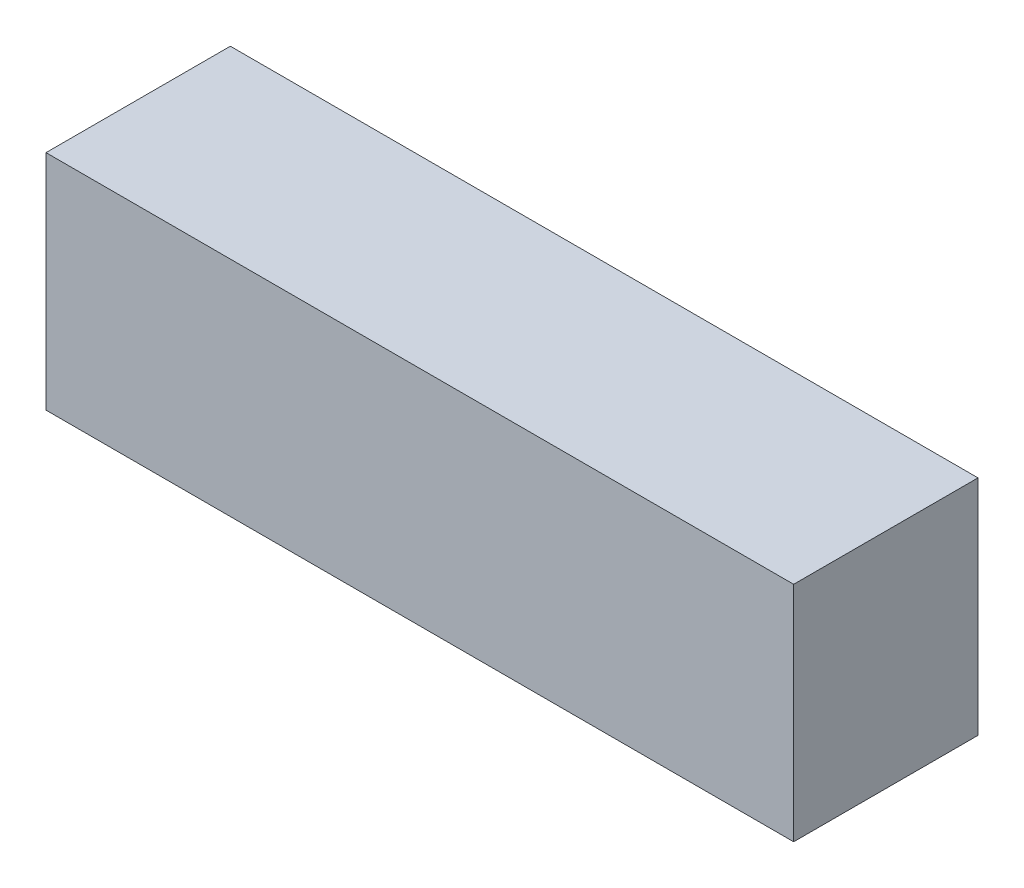
ISO-10303-21;
HEADER;
FILE_DESCRIPTION(('STEP AP214'),'2;1');
FILE_NAME('part.step','',(''),(''),'','','');
FILE_SCHEMA(('AUTOMOTIVE_DESIGN { 1 0 10303 214 1 1 1 1 }'));
ENDSEC;
DATA;
#1=APPLICATION_CONTEXT('core data for automotive mechanical design processes');
#2=APPLICATION_PROTOCOL_DEFINITION('international standard','automotive_design',2000,#1);
#3=PRODUCT_CONTEXT('',#1,'mechanical');
#4=PRODUCT('Part','Part','',(#3));
#5=PRODUCT_RELATED_PRODUCT_CATEGORY('part','',(#4));
#6=PRODUCT_DEFINITION_FORMATION('','',#4);
#7=PRODUCT_DEFINITION_CONTEXT('part definition',#1,'design');
#8=PRODUCT_DEFINITION('design','',#6,#7);
#9=PRODUCT_DEFINITION_SHAPE('','',#8);
#10=(LENGTH_UNIT() NAMED_UNIT(*) SI_UNIT(.MILLI.,.METRE.));
#11=(NAMED_UNIT(*) PLANE_ANGLE_UNIT() SI_UNIT($,.RADIAN.));
#12=(NAMED_UNIT(*) SI_UNIT($,.STERADIAN.) SOLID_ANGLE_UNIT());
#13=UNCERTAINTY_MEASURE_WITH_UNIT(LENGTH_MEASURE(1.E-05),#10,'distance_accuracy_value','');
#14=(GEOMETRIC_REPRESENTATION_CONTEXT(3) GLOBAL_UNCERTAINTY_ASSIGNED_CONTEXT((#13)) GLOBAL_UNIT_ASSIGNED_CONTEXT((#10,
#11,#12)) REPRESENTATION_CONTEXT('',''));
#15=CARTESIAN_POINT('',(0.,0.,0.));
#16=DIRECTION('',(0.,0.,1.));
#17=DIRECTION('',(1.,0.,0.));
#18=AXIS2_PLACEMENT_3D('',#15,#16,#17);
#19=CARTESIAN_POINT('',(0.,0.,36.322));
#20=DIRECTION('',(1.,0.,0.));
#21=DIRECTION('',(0.,0.,-1.));
#22=AXIS2_PLACEMENT_3D('',#19,#20,#21);
#23=PLANE('',#22);
#24=DIRECTION('',(0.,-1.,0.));
#25=VECTOR('',#24,1.);
#26=CARTESIAN_POINT('',(0.,0.,0.));
#27=LINE('',#26,#25);
#28=CARTESIAN_POINT('',(0.,43.942,0.));
#29=VERTEX_POINT('',#28);
#30=CARTESIAN_POINT('',(0.,0.,0.));
#31=VERTEX_POINT('',#30);
#32=EDGE_CURVE('E96',#29,#31,#27,.T.);
#33=ORIENTED_EDGE('',*,*,#32,.T.);
#34=DIRECTION('',(0.,0.,-1.));
#35=VECTOR('',#34,1.);
#36=CARTESIAN_POINT('',(0.,0.,36.322));
#37=LINE('',#36,#35);
#38=CARTESIAN_POINT('',(0.,0.,36.322));
#39=VERTEX_POINT('',#38);
#40=EDGE_CURVE('E11',#39,#31,#37,.T.);
#41=ORIENTED_EDGE('',*,*,#40,.F.);
#42=DIRECTION('',(0.,-1.,0.));
#43=VECTOR('',#42,1.);
#44=CARTESIAN_POINT('',(0.,0.,36.322));
#45=LINE('',#44,#43);
#46=CARTESIAN_POINT('',(0.,43.942,36.322));
#47=VERTEX_POINT('',#46);
#48=EDGE_CURVE('E84',#47,#39,#45,.T.);
#49=ORIENTED_EDGE('',*,*,#48,.F.);
#50=DIRECTION('',(0.,0.,-1.));
#51=VECTOR('',#50,1.);
#52=CARTESIAN_POINT('',(0.,43.942,36.322));
#53=LINE('',#52,#51);
#54=EDGE_CURVE('E92',#47,#29,#53,.T.);
#55=ORIENTED_EDGE('',*,*,#54,.T.);
#56=EDGE_LOOP('',(#33,#41,#49,#55));
#57=FACE_BOUND('',#56,.T.);
#58=ADVANCED_FACE('F33',(#57),#23,.F.);
#59=CARTESIAN_POINT('',(0.,0.,36.322));
#60=DIRECTION('',(0.,1.,0.));
#61=DIRECTION('',(0.,0.,1.));
#62=AXIS2_PLACEMENT_3D('',#59,#60,#61);
#63=PLANE('',#62);
#64=DIRECTION('',(1.,0.,0.));
#65=VECTOR('',#64,1.);
#66=CARTESIAN_POINT('',(0.,0.,0.));
#67=LINE('',#66,#65);
#68=CARTESIAN_POINT('',(147.32,0.,0.));
#69=VERTEX_POINT('',#68);
#70=EDGE_CURVE('E88',#31,#69,#67,.T.);
#71=ORIENTED_EDGE('',*,*,#70,.T.);
#72=DIRECTION('',(0.,0.,-1.));
#73=VECTOR('',#72,1.);
#74=CARTESIAN_POINT('',(147.32,0.,36.322));
#75=LINE('',#74,#73);
#76=CARTESIAN_POINT('',(147.32,0.,36.322));
#77=VERTEX_POINT('',#76);
#78=EDGE_CURVE('E41',#77,#69,#75,.T.);
#79=ORIENTED_EDGE('',*,*,#78,.F.);
#80=DIRECTION('',(1.,0.,0.));
#81=VECTOR('',#80,1.);
#82=CARTESIAN_POINT('',(0.,0.,36.322));
#83=LINE('',#82,#81);
#84=EDGE_CURVE('E79',#39,#77,#83,.T.);
#85=ORIENTED_EDGE('',*,*,#84,.F.);
#86=ORIENTED_EDGE('',*,*,#40,.T.);
#87=EDGE_LOOP('',(#71,#79,#85,#86));
#88=FACE_BOUND('',#87,.T.);
#89=ADVANCED_FACE('F87',(#88),#63,.F.);
#90=CARTESIAN_POINT('',(147.32,0.,36.322));
#91=DIRECTION('',(-1.,0.,0.));
#92=DIRECTION('',(0.,0.,1.));
#93=AXIS2_PLACEMENT_3D('',#90,#91,#92);
#94=PLANE('',#93);
#95=DIRECTION('',(0.,1.,0.));
#96=VECTOR('',#95,1.);
#97=CARTESIAN_POINT('',(147.32,0.,0.));
#98=LINE('',#97,#96);
#99=CARTESIAN_POINT('',(147.32,43.942,0.));
#100=VERTEX_POINT('',#99);
#101=EDGE_CURVE('E66',#69,#100,#98,.T.);
#102=ORIENTED_EDGE('',*,*,#101,.T.);
#103=DIRECTION('',(0.,0.,-1.));
#104=VECTOR('',#103,1.);
#105=CARTESIAN_POINT('',(147.32,43.942,36.322));
#106=LINE('',#105,#104);
#107=CARTESIAN_POINT('',(147.32,43.942,36.322));
#108=VERTEX_POINT('',#107);
#109=EDGE_CURVE('E89',#108,#100,#106,.T.);
#110=ORIENTED_EDGE('',*,*,#109,.F.);
#111=DIRECTION('',(0.,1.,0.));
#112=VECTOR('',#111,1.);
#113=CARTESIAN_POINT('',(147.32,0.,36.322));
#114=LINE('',#113,#112);
#115=EDGE_CURVE('E82',#77,#108,#114,.T.);
#116=ORIENTED_EDGE('',*,*,#115,.F.);
#117=ORIENTED_EDGE('',*,*,#78,.T.);
#118=EDGE_LOOP('',(#102,#110,#116,#117));
#119=FACE_BOUND('',#118,.T.);
#120=ADVANCED_FACE('F90',(#119),#94,.F.);
#121=CARTESIAN_POINT('',(0.,43.942,36.322));
#122=DIRECTION('',(0.,-1.,0.));
#123=DIRECTION('',(0.,0.,-1.));
#124=AXIS2_PLACEMENT_3D('',#121,#122,#123);
#125=PLANE('',#124);
#126=DIRECTION('',(-1.,0.,0.));
#127=VECTOR('',#126,1.);
#128=CARTESIAN_POINT('',(0.,43.942,0.));
#129=LINE('',#128,#127);
#130=EDGE_CURVE('E72',#100,#29,#129,.T.);
#131=ORIENTED_EDGE('',*,*,#130,.T.);
#132=ORIENTED_EDGE('',*,*,#54,.F.);
#133=DIRECTION('',(-1.,0.,0.));
#134=VECTOR('',#133,1.);
#135=CARTESIAN_POINT('',(0.,43.942,36.322));
#136=LINE('',#135,#134);
#137=EDGE_CURVE('E49',#108,#47,#136,.T.);
#138=ORIENTED_EDGE('',*,*,#137,.F.);
#139=ORIENTED_EDGE('',*,*,#109,.T.);
#140=EDGE_LOOP('',(#131,#132,#138,#139));
#141=FACE_BOUND('',#140,.T.);
#142=ADVANCED_FACE('F103',(#141),#125,.F.);
#143=CARTESIAN_POINT('',(0.,0.,36.322));
#144=DIRECTION('',(0.,0.,-1.));
#145=DIRECTION('',(-1.,0.,0.));
#146=AXIS2_PLACEMENT_3D('',#143,#144,#145);
#147=PLANE('',#146);
#148=ORIENTED_EDGE('',*,*,#48,.T.);
#149=ORIENTED_EDGE('',*,*,#84,.T.);
#150=ORIENTED_EDGE('',*,*,#115,.T.);
#151=ORIENTED_EDGE('',*,*,#137,.T.);
#152=EDGE_LOOP('',(#148,#149,#150,#151));
#153=FACE_BOUND('',#152,.T.);
#154=ADVANCED_FACE('F80',(#153),#147,.F.);
#155=CARTESIAN_POINT('',(0.,0.,0.));
#156=DIRECTION('',(0.,0.,-1.));
#157=DIRECTION('',(-1.,0.,0.));
#158=AXIS2_PLACEMENT_3D('',#155,#156,#157);
#159=PLANE('',#158);
#160=ORIENTED_EDGE('',*,*,#32,.F.);
#161=ORIENTED_EDGE('',*,*,#130,.F.);
#162=ORIENTED_EDGE('',*,*,#101,.F.);
#163=ORIENTED_EDGE('',*,*,#70,.F.);
#164=EDGE_LOOP('',(#160,#161,#162,#163));
#165=FACE_BOUND('',#164,.T.);
#166=ADVANCED_FACE('F106',(#165),#159,.T.);
#167=CLOSED_SHELL('',(#58,#89,#120,#142,#154,#166));
#168=MANIFOLD_SOLID_BREP('B2',#167);
#169=ADVANCED_BREP_SHAPE_REPRESENTATION('',(#18,#168),#14);
#170=SHAPE_DEFINITION_REPRESENTATION(#9,#169);
ENDSEC;
END-ISO-10303-21;
